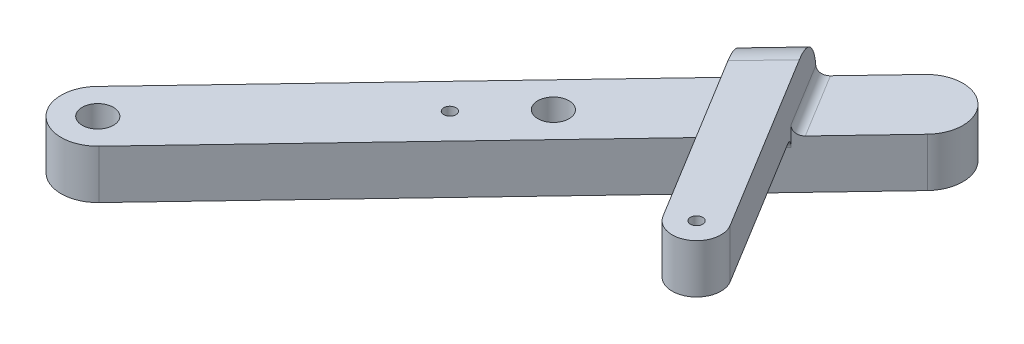
ISO-10303-21;
HEADER;
FILE_DESCRIPTION(('STEP AP214'),'2;1');
FILE_NAME('part.step','',(''),(''),'','','');
FILE_SCHEMA(('AUTOMOTIVE_DESIGN { 1 0 10303 214 1 1 1 1 }'));
ENDSEC;
DATA;
#1=APPLICATION_CONTEXT('core data for automotive mechanical design processes');
#2=APPLICATION_PROTOCOL_DEFINITION('international standard','automotive_design',2000,#1);
#3=PRODUCT_CONTEXT('',#1,'mechanical');
#4=PRODUCT('Part','Part','',(#3));
#5=PRODUCT_RELATED_PRODUCT_CATEGORY('part','',(#4));
#6=PRODUCT_DEFINITION_FORMATION('','',#4);
#7=PRODUCT_DEFINITION_CONTEXT('part definition',#1,'design');
#8=PRODUCT_DEFINITION('design','',#6,#7);
#9=PRODUCT_DEFINITION_SHAPE('','',#8);
#10=(LENGTH_UNIT() NAMED_UNIT(*) SI_UNIT(.MILLI.,.METRE.));
#11=(NAMED_UNIT(*) PLANE_ANGLE_UNIT() SI_UNIT($,.RADIAN.));
#12=(NAMED_UNIT(*) SI_UNIT($,.STERADIAN.) SOLID_ANGLE_UNIT());
#13=UNCERTAINTY_MEASURE_WITH_UNIT(LENGTH_MEASURE(1.E-05),#10,'distance_accuracy_value','');
#14=(GEOMETRIC_REPRESENTATION_CONTEXT(3) GLOBAL_UNCERTAINTY_ASSIGNED_CONTEXT((#13)) GLOBAL_UNIT_ASSIGNED_CONTEXT((#10,
#11,#12)) REPRESENTATION_CONTEXT('',''));
#15=CARTESIAN_POINT('',(0.,0.,0.));
#16=DIRECTION('',(0.,0.,1.));
#17=DIRECTION('',(1.,0.,0.));
#18=AXIS2_PLACEMENT_3D('',#15,#16,#17);
#19=CARTESIAN_POINT('',(0.,0.,0.));
#20=DIRECTION('',(0.,1.,0.));
#21=DIRECTION('',(0.,0.,1.));
#22=AXIS2_PLACEMENT_3D('',#19,#20,#21);
#23=PLANE('',#22);
#24=DIRECTION('',(0.689150046593771,0.,-0.724618667493326));
#25=VECTOR('',#24,1.);
#26=CARTESIAN_POINT('',(-4.93378544040316,0.,-4.69228660351733));
#27=LINE('',#26,#25);
#28=CARTESIAN_POINT('',(64.1179855432319,0.,-77.2979586563996));
#29=VERTEX_POINT('',#28);
#30=CARTESIAN_POINT('',(73.5491158361503,0.,-87.2144827857797));
#31=VERTEX_POINT('',#30);
#32=EDGE_CURVE('E214',#29,#31,#27,.T.);
#33=ORIENTED_EDGE('',*,*,#32,.F.);
#34=DIRECTION('',(0.521562728151214,0.,0.853212939777324));
#35=VECTOR('',#34,1.);
#36=CARTESIAN_POINT('',(72.4969122025222,0.,-63.5910577194925));
#37=LINE('',#36,#35);
#38=CARTESIAN_POINT('',(72.2174075789016,0.,-64.0482931558628));
#39=VERTEX_POINT('',#38);
#40=EDGE_CURVE('E243',#29,#39,#37,.T.);
#41=ORIENTED_EDGE('',*,*,#40,.T.);
#42=DIRECTION('',(0.689150046593771,0.,-0.724618667493326));
#43=VECTOR('',#42,1.);
#44=CARTESIAN_POINT('',(5.93549457199673,0.,5.64496409538924));
#45=LINE('',#44,#43);
#46=CARTESIAN_POINT('',(84.4183958485502,0.,-76.8772320868731));
#47=VERTEX_POINT('',#46);
#48=EDGE_CURVE('E207',#39,#47,#45,.T.);
#49=ORIENTED_EDGE('',*,*,#48,.T.);
#50=CARTESIAN_POINT('',(78.9837558423502,0.,-82.0458574363263));
#51=DIRECTION('',(0.,1.,0.));
#52=DIRECTION('',(0.,0.,1.));
#53=AXIS2_PLACEMENT_3D('',#50,#51,#52);
#54=CIRCLE('',#53,7.49999999999997);
#55=EDGE_CURVE('E208',#31,#47,#54,.F.);
#56=ORIENTED_EDGE('',*,*,#55,.F.);
#57=EDGE_LOOP('',(#33,#41,#49,#56));
#58=FACE_BOUND('',#57,.T.);
#59=ADVANCED_FACE('F41',(#58),#23,.T.);
#60=CARTESIAN_POINT('',(-3.7142497489023,-10.,4.90838266287273));
#61=DIRECTION('',(0.,1.,0.));
#62=DIRECTION('',(0.,0.,1.));
#63=AXIS2_PLACEMENT_3D('',#60,#61,#62);
#64=CYLINDRICAL_SURFACE('',#63,7.5);
#65=CARTESIAN_POINT('',(-3.7142497489023,0.,4.90838266287273));
#66=DIRECTION('',(0.,1.,0.));
#67=DIRECTION('',(0.,0.,1.));
#68=AXIS2_PLACEMENT_3D('',#65,#66,#67);
#69=CIRCLE('',#68,7.5);
#70=CARTESIAN_POINT('',(1.72039025729765,0.,10.077008012326));
#71=VERTEX_POINT('',#70);
#72=CARTESIAN_POINT('',(-9.14888975510225,0.,-0.260242686580554));
#73=VERTEX_POINT('',#72);
#74=EDGE_CURVE('E202',#71,#73,#69,.F.);
#75=ORIENTED_EDGE('',*,*,#74,.T.);
#76=DIRECTION('',(0.,1.,0.));
#77=VECTOR('',#76,1.);
#78=CARTESIAN_POINT('',(-9.14888975510225,-10.,-0.260242686580554));
#79=LINE('',#78,#77);
#80=CARTESIAN_POINT('',(-9.14888975510225,-10.,-0.260242686580554));
#81=VERTEX_POINT('',#80);
#82=EDGE_CURVE('E217',#81,#73,#79,.T.);
#83=ORIENTED_EDGE('',*,*,#82,.F.);
#84=CARTESIAN_POINT('',(-3.7142497489023,-10.,4.90838266287273));
#85=DIRECTION('',(0.,1.,0.));
#86=DIRECTION('',(0.,0.,1.));
#87=AXIS2_PLACEMENT_3D('',#84,#85,#86);
#88=CIRCLE('',#87,7.5);
#89=CARTESIAN_POINT('',(1.72039025729765,-10.,10.077008012326));
#90=VERTEX_POINT('',#89);
#91=EDGE_CURVE('E183',#90,#81,#88,.F.);
#92=ORIENTED_EDGE('',*,*,#91,.F.);
#93=DIRECTION('',(0.,1.,0.));
#94=VECTOR('',#93,1.);
#95=CARTESIAN_POINT('',(1.72039025729765,-10.,10.077008012326));
#96=LINE('',#95,#94);
#97=EDGE_CURVE('E200',#90,#71,#96,.T.);
#98=ORIENTED_EDGE('',*,*,#97,.T.);
#99=EDGE_LOOP('',(#75,#83,#92,#98));
#100=FACE_BOUND('',#99,.T.);
#101=ADVANCED_FACE('F291',(#100),#64,.T.);
#102=CARTESIAN_POINT('',(-4.93378544040316,-10.,-4.69228660351733));
#103=DIRECTION('',(0.724618667493326,0.,0.689150046593771));
#104=DIRECTION('',(0.689150046593771,0.,-0.724618667493326));
#105=AXIS2_PLACEMENT_3D('',#102,#103,#104);
#106=PLANE('',#105);
#107=CARTESIAN_POINT('',(54.1295367516934,0.,-66.795432407691));
#108=VERTEX_POINT('',#107);
#109=EDGE_CURVE('E213',#73,#108,#27,.T.);
#110=ORIENTED_EDGE('',*,*,#109,.T.);
#111=DIRECTION('',(0.689150046593771,0.,-0.724618667493326));
#112=VECTOR('',#111,1.);
#113=CARTESIAN_POINT('',(62.6910642872978,0.,-75.797597763727));
#114=LINE('',#113,#112);
#115=EDGE_CURVE('E225',#108,#29,#114,.T.);
#116=ORIENTED_EDGE('',*,*,#115,.T.);
#117=ORIENTED_EDGE('',*,*,#32,.T.);
#118=DIRECTION('',(0.,1.,0.));
#119=VECTOR('',#118,1.);
#120=CARTESIAN_POINT('',(73.5491158361503,-10.,-87.2144827857797));
#121=LINE('',#120,#119);
#122=CARTESIAN_POINT('',(73.5491158361503,-10.,-87.2144827857797));
#123=VERTEX_POINT('',#122);
#124=EDGE_CURVE('E222',#123,#31,#121,.T.);
#125=ORIENTED_EDGE('',*,*,#124,.F.);
#126=DIRECTION('',(0.689150046593771,0.,-0.724618667493326));
#127=VECTOR('',#126,1.);
#128=CARTESIAN_POINT('',(-4.93378544040316,-10.,-4.69228660351733));
#129=LINE('',#128,#127);
#130=EDGE_CURVE('E192',#81,#123,#129,.T.);
#131=ORIENTED_EDGE('',*,*,#130,.F.);
#132=ORIENTED_EDGE('',*,*,#82,.T.);
#133=EDGE_LOOP('',(#110,#116,#117,#125,#131,#132));
#134=FACE_BOUND('',#133,.T.);
#135=ADVANCED_FACE('F305',(#134),#106,.F.);
#136=CARTESIAN_POINT('',(78.9837558423502,-10.,-82.0458574363263));
#137=DIRECTION('',(0.,1.,0.));
#138=DIRECTION('',(0.,0.,1.));
#139=AXIS2_PLACEMENT_3D('',#136,#137,#138);
#140=CYLINDRICAL_SURFACE('',#139,7.49999999999997);
#141=ORIENTED_EDGE('',*,*,#55,.T.);
#142=DIRECTION('',(0.,1.,0.));
#143=VECTOR('',#142,1.);
#144=CARTESIAN_POINT('',(84.4183958485502,-10.,-76.8772320868731));
#145=LINE('',#144,#143);
#146=CARTESIAN_POINT('',(84.4183958485502,-10.,-76.8772320868731));
#147=VERTEX_POINT('',#146);
#148=EDGE_CURVE('E228',#147,#47,#145,.T.);
#149=ORIENTED_EDGE('',*,*,#148,.F.);
#150=CARTESIAN_POINT('',(78.9837558423502,-10.,-82.0458574363263));
#151=DIRECTION('',(0.,1.,0.));
#152=DIRECTION('',(0.,0.,1.));
#153=AXIS2_PLACEMENT_3D('',#150,#151,#152);
#154=CIRCLE('',#153,7.49999999999997);
#155=EDGE_CURVE('E188',#123,#147,#154,.F.);
#156=ORIENTED_EDGE('',*,*,#155,.F.);
#157=ORIENTED_EDGE('',*,*,#124,.T.);
#158=EDGE_LOOP('',(#141,#149,#156,#157));
#159=FACE_BOUND('',#158,.T.);
#160=ADVANCED_FACE('F338',(#159),#140,.T.);
#161=CARTESIAN_POINT('',(5.93549457199673,-10.,5.64496409538924));
#162=DIRECTION('',(0.724618667493326,0.,0.689150046593771));
#163=DIRECTION('',(0.689150046593771,0.,-0.724618667493326));
#164=AXIS2_PLACEMENT_3D('',#161,#162,#163);
#165=PLANE('',#164);
#166=DIRECTION('',(0.,1.,0.));
#167=VECTOR('',#166,1.);
#168=CARTESIAN_POINT('',(70.7904863229676,-10.,-62.5479322631901));
#169=LINE('',#168,#167);
#170=CARTESIAN_POINT('',(70.7904863229676,-2.,-62.5479322631901));
#171=VERTEX_POINT('',#170);
#172=CARTESIAN_POINT('',(70.7904863229676,2.,-62.5479322631901));
#173=VERTEX_POINT('',#172);
#174=EDGE_CURVE('E57',#171,#173,#169,.T.);
#175=ORIENTED_EDGE('',*,*,#174,.F.);
#176=DIRECTION('',(0.689150046593771,0.,-0.724618667493326));
#177=VECTOR('',#176,1.);
#178=CARTESIAN_POINT('',(5.93549457199673,-2.,5.64496409538924));
#179=LINE('',#178,#177);
#180=CARTESIAN_POINT('',(63.6558800432973,-2.,-55.0461277998267));
#181=VERTEX_POINT('',#180);
#182=EDGE_CURVE('E373',#171,#181,#179,.F.);
#183=ORIENTED_EDGE('',*,*,#182,.T.);
#184=DIRECTION('',(0.,-1.,0.));
#185=VECTOR('',#184,1.);
#186=CARTESIAN_POINT('',(63.6558800432973,10.,-55.0461277998267));
#187=LINE('',#186,#185);
#188=CARTESIAN_POINT('',(63.6558800432973,2.,-55.0461277998267));
#189=VERTEX_POINT('',#188);
#190=EDGE_CURVE('E64',#189,#181,#187,.T.);
#191=ORIENTED_EDGE('',*,*,#190,.F.);
#192=CARTESIAN_POINT('',(62.2289587873632,2.,-53.5457669071541));
#193=DIRECTION('',(0.724618667493326,0.,0.689150046593771));
#194=DIRECTION('',(-0.689150046593771,0.,0.724618667493326));
#195=AXIS2_PLACEMENT_3D('',#192,#193,#194);
#196=ELLIPSE('',#195,2.07055236082017,2.);
#197=CARTESIAN_POINT('',(62.2289587873632,0.,-53.5457669071541));
#198=VERTEX_POINT('',#197);
#199=EDGE_CURVE('E248',#189,#198,#196,.F.);
#200=ORIENTED_EDGE('',*,*,#199,.T.);
#201=EDGE_CURVE('E210',#71,#198,#45,.T.);
#202=ORIENTED_EDGE('',*,*,#201,.F.);
#203=ORIENTED_EDGE('',*,*,#97,.F.);
#204=DIRECTION('',(0.689150046593771,0.,-0.724618667493326));
#205=VECTOR('',#204,1.);
#206=CARTESIAN_POINT('',(5.93549457199673,-10.,5.64496409538924));
#207=LINE('',#206,#205);
#208=EDGE_CURVE('E190',#90,#147,#207,.T.);
#209=ORIENTED_EDGE('',*,*,#208,.T.);
#210=ORIENTED_EDGE('',*,*,#148,.T.);
#211=ORIENTED_EDGE('',*,*,#48,.F.);
#212=CARTESIAN_POINT('',(72.2174075789016,2.,-64.0482931558628));
#213=DIRECTION('',(0.724618667493326,0.,0.689150046593771));
#214=DIRECTION('',(0.689150046593771,0.,-0.724618667493326));
#215=AXIS2_PLACEMENT_3D('',#212,#213,#214);
#216=ELLIPSE('',#215,2.07055236082017,2.);
#217=EDGE_CURVE('E258',#39,#173,#216,.F.);
#218=ORIENTED_EDGE('',*,*,#217,.T.);
#219=EDGE_LOOP('',(#175,#183,#191,#200,#202,#203,#209,#210,#211,#218));
#220=FACE_BOUND('',#219,.T.);
#221=ADVANCED_FACE('F343',(#220),#165,.T.);
#222=CARTESIAN_POINT('',(41.7696533262866,-10.,-42.9164493916868));
#223=DIRECTION('',(0.,1.,0.));
#224=DIRECTION('',(0.,0.,1.));
#225=AXIS2_PLACEMENT_3D('',#222,#223,#224);
#226=CYLINDRICAL_SURFACE('',#225,3.2);
#227=CARTESIAN_POINT('',(41.7696533262866,-10.,-42.9164493916868));
#228=DIRECTION('',(0.,1.,0.));
#229=DIRECTION('',(0.,0.,1.));
#230=AXIS2_PLACEMENT_3D('',#227,#228,#229);
#231=CIRCLE('',#230,3.2);
#232=CARTESIAN_POINT('',(41.7696533262866,-10.,-39.7164493916868));
#233=VERTEX_POINT('',#232);
#234=EDGE_CURVE('E179',#233,#233,#231,.T.);
#235=ORIENTED_EDGE('',*,*,#234,.F.);
#236=EDGE_LOOP('',(#235));
#237=FACE_BOUND('',#236,.T.);
#238=CARTESIAN_POINT('',(41.7696533262866,0.,-42.9164493916868));
#239=DIRECTION('',(0.,1.,0.));
#240=DIRECTION('',(0.,0.,1.));
#241=AXIS2_PLACEMENT_3D('',#238,#239,#240);
#242=CIRCLE('',#241,3.2);
#243=CARTESIAN_POINT('',(41.7696533262866,0.,-39.7164493916868));
#244=VERTEX_POINT('',#243);
#245=EDGE_CURVE('E199',#244,#244,#242,.T.);
#246=ORIENTED_EDGE('',*,*,#245,.T.);
#247=EDGE_LOOP('',(#246));
#248=FACE_BOUND('',#247,.T.);
#249=ADVANCED_FACE('F334',(#237,#248),#226,.F.);
#250=CARTESIAN_POINT('',(31.43240262738,-10.,-32.0471693792869));
#251=DIRECTION('',(0.,1.,0.));
#252=DIRECTION('',(0.,0.,1.));
#253=AXIS2_PLACEMENT_3D('',#250,#251,#252);
#254=CYLINDRICAL_SURFACE('',#253,1.25);
#255=CARTESIAN_POINT('',(31.43240262738,-10.,-32.0471693792869));
#256=DIRECTION('',(0.,1.,0.));
#257=DIRECTION('',(0.,0.,1.));
#258=AXIS2_PLACEMENT_3D('',#255,#256,#257);
#259=CIRCLE('',#258,1.25);
#260=CARTESIAN_POINT('',(31.43240262738,-10.,-30.7971693792869));
#261=VERTEX_POINT('',#260);
#262=EDGE_CURVE('E180',#261,#261,#259,.T.);
#263=ORIENTED_EDGE('',*,*,#262,.F.);
#264=EDGE_LOOP('',(#263));
#265=FACE_BOUND('',#264,.T.);
#266=CARTESIAN_POINT('',(31.43240262738,0.,-32.0471693792869));
#267=DIRECTION('',(0.,1.,0.));
#268=DIRECTION('',(0.,0.,1.));
#269=AXIS2_PLACEMENT_3D('',#266,#267,#268);
#270=CIRCLE('',#269,1.25);
#271=CARTESIAN_POINT('',(31.43240262738,0.,-30.7971693792869));
#272=VERTEX_POINT('',#271);
#273=EDGE_CURVE('E156',#272,#272,#270,.T.);
#274=ORIENTED_EDGE('',*,*,#273,.T.);
#275=EDGE_LOOP('',(#274));
#276=FACE_BOUND('',#275,.T.);
#277=ADVANCED_FACE('F267',(#265,#276),#254,.F.);
#278=CARTESIAN_POINT('',(-3.7142497489023,-10.,4.90838266287273));
#279=DIRECTION('',(0.,1.,0.));
#280=DIRECTION('',(0.,0.,1.));
#281=AXIS2_PLACEMENT_3D('',#278,#279,#280);
#282=CYLINDRICAL_SURFACE('',#281,3.2);
#283=CARTESIAN_POINT('',(-3.7142497489023,-10.,4.90838266287273));
#284=DIRECTION('',(0.,1.,0.));
#285=DIRECTION('',(0.,0.,1.));
#286=AXIS2_PLACEMENT_3D('',#283,#284,#285);
#287=CIRCLE('',#286,3.2);
#288=CARTESIAN_POINT('',(-3.7142497489023,-10.,8.10838266287273));
#289=VERTEX_POINT('',#288);
#290=EDGE_CURVE('E193',#289,#289,#287,.T.);
#291=ORIENTED_EDGE('',*,*,#290,.F.);
#292=EDGE_LOOP('',(#291));
#293=FACE_BOUND('',#292,.T.);
#294=CARTESIAN_POINT('',(-3.7142497489023,0.,4.90838266287273));
#295=DIRECTION('',(0.,1.,0.));
#296=DIRECTION('',(0.,0.,1.));
#297=AXIS2_PLACEMENT_3D('',#294,#295,#296);
#298=CIRCLE('',#297,3.2);
#299=CARTESIAN_POINT('',(-3.7142497489023,0.,8.10838266287273));
#300=VERTEX_POINT('',#299);
#301=EDGE_CURVE('E181',#300,#300,#298,.T.);
#302=ORIENTED_EDGE('',*,*,#301,.T.);
#303=EDGE_LOOP('',(#302));
#304=FACE_BOUND('',#303,.T.);
#305=ADVANCED_FACE('F319',(#293,#304),#282,.F.);
#306=CARTESIAN_POINT('',(0.,-10.,0.));
#307=DIRECTION('',(0.,1.,0.));
#308=DIRECTION('',(0.,0.,1.));
#309=AXIS2_PLACEMENT_3D('',#306,#307,#308);
#310=PLANE('',#309);
#311=ORIENTED_EDGE('',*,*,#262,.T.);
#312=EDGE_LOOP('',(#311));
#313=FACE_BOUND('',#312,.T.);
#314=ORIENTED_EDGE('',*,*,#234,.T.);
#315=EDGE_LOOP('',(#314));
#316=FACE_BOUND('',#315,.T.);
#317=ORIENTED_EDGE('',*,*,#91,.T.);
#318=ORIENTED_EDGE('',*,*,#130,.T.);
#319=ORIENTED_EDGE('',*,*,#155,.T.);
#320=ORIENTED_EDGE('',*,*,#208,.F.);
#321=EDGE_LOOP('',(#317,#318,#319,#320));
#322=FACE_BOUND('',#321,.T.);
#323=ORIENTED_EDGE('',*,*,#290,.T.);
#324=EDGE_LOOP('',(#323));
#325=FACE_BOUND('',#324,.T.);
#326=ADVANCED_FACE('F309',(#313,#316,#322,#325),#310,.F.);
#327=ORIENTED_EDGE('',*,*,#201,.T.);
#328=DIRECTION('',(0.521562728151213,0.,0.853212939777324));
#329=VECTOR('',#328,1.);
#330=CARTESIAN_POINT('',(69.1290436652468,0.,-42.2580705561502));
#331=LINE('',#330,#329);
#332=EDGE_CURVE('E239',#198,#108,#331,.F.);
#333=ORIENTED_EDGE('',*,*,#332,.T.);
#334=ORIENTED_EDGE('',*,*,#109,.F.);
#335=ORIENTED_EDGE('',*,*,#74,.F.);
#336=EDGE_LOOP('',(#327,#333,#334,#335));
#337=FACE_BOUND('',#336,.T.);
#338=ORIENTED_EDGE('',*,*,#273,.F.);
#339=EDGE_LOOP('',(#338));
#340=FACE_BOUND('',#339,.T.);
#341=ORIENTED_EDGE('',*,*,#245,.F.);
#342=EDGE_LOOP('',(#341));
#343=FACE_BOUND('',#342,.T.);
#344=ORIENTED_EDGE('',*,*,#301,.F.);
#345=EDGE_LOOP('',(#344));
#346=FACE_BOUND('',#345,.T.);
#347=ADVANCED_FACE('F298',(#337,#340,#343,#346),#23,.T.);
#348=CARTESIAN_POINT('',(0.,0.,0.));
#349=DIRECTION('',(0.,1.,0.));
#350=DIRECTION('',(0.,0.,1.));
#351=AXIS2_PLACEMENT_3D('',#348,#349,#350);
#352=PLANE('',#351);
#353=CARTESIAN_POINT('',(86.1218345996952,0.,-27.8811438635889));
#354=DIRECTION('',(0.,1.,0.));
#355=DIRECTION('',(0.,0.,1.));
#356=AXIS2_PLACEMENT_3D('',#353,#354,#355);
#357=CIRCLE('',#356,1.25000000000001);
#358=CARTESIAN_POINT('',(86.1218345996952,0.,-26.6311438635889));
#359=VERTEX_POINT('',#358);
#360=EDGE_CURVE('E169',#359,#359,#357,.T.);
#361=ORIENTED_EDGE('',*,*,#360,.T.);
#362=EDGE_LOOP('',(#361));
#363=FACE_BOUND('',#362,.T.);
#364=DIRECTION('',(0.521562728151213,0.,0.853212939777324));
#365=VECTOR('',#364,1.);
#366=CARTESIAN_POINT('',(70.8354695448014,0.,-43.3011960124526));
#367=LINE('',#366,#365);
#368=CARTESIAN_POINT('',(64.7358029813866,0.,-53.2795057330885));
#369=VERTEX_POINT('',#368);
#370=CARTESIAN_POINT('',(81.8557699008086,0.,-25.2733302228328));
#371=VERTEX_POINT('',#370);
#372=EDGE_CURVE('E164',#369,#371,#367,.T.);
#373=ORIENTED_EDGE('',*,*,#372,.F.);
#374=DIRECTION('',(0.689150046593771,0.,-0.724618667493326));
#375=VECTOR('',#374,1.);
#376=CARTESIAN_POINT('',(7.38473190698338,0.,7.02326418857678));
#377=LINE('',#376,#375);
#378=CARTESIAN_POINT('',(71.8704092610569,0.,-60.7813101964518));
#379=VERTEX_POINT('',#378);
#380=EDGE_CURVE('E279',#369,#379,#377,.T.);
#381=ORIENTED_EDGE('',*,*,#380,.T.);
#382=DIRECTION('',(0.521562728151214,0.,0.853212939777324));
#383=VECTOR('',#382,1.);
#384=CARTESIAN_POINT('',(79.3675989425746,0.,-48.5168232939648));
#385=LINE('',#384,#383);
#386=CARTESIAN_POINT('',(90.3878992985819,0.,-30.488957504345));
#387=VERTEX_POINT('',#386);
#388=EDGE_CURVE('E173',#379,#387,#385,.T.);
#389=ORIENTED_EDGE('',*,*,#388,.T.);
#390=CARTESIAN_POINT('',(86.1218345996952,0.,-27.8811438635889));
#391=DIRECTION('',(0.,1.,0.));
#392=DIRECTION('',(0.,0.,1.));
#393=AXIS2_PLACEMENT_3D('',#390,#391,#392);
#394=CIRCLE('',#393,5.);
#395=EDGE_CURVE('E154',#387,#371,#394,.F.);
#396=ORIENTED_EDGE('',*,*,#395,.T.);
#397=EDGE_LOOP('',(#373,#381,#389,#396));
#398=FACE_BOUND('',#397,.T.);
#399=ADVANCED_FACE('F307',(#363,#398),#352,.F.);
#400=CARTESIAN_POINT('',(86.1218345996952,10.,-27.8811438635889));
#401=DIRECTION('',(0.,-1.,0.));
#402=DIRECTION('',(0.,0.,-1.));
#403=AXIS2_PLACEMENT_3D('',#400,#401,#402);
#404=CYLINDRICAL_SURFACE('',#403,5.);
#405=ORIENTED_EDGE('',*,*,#395,.F.);
#406=DIRECTION('',(0.,-1.,0.));
#407=VECTOR('',#406,1.);
#408=CARTESIAN_POINT('',(90.3878992985819,10.,-30.488957504345));
#409=LINE('',#408,#407);
#410=CARTESIAN_POINT('',(90.3878992985819,10.,-30.488957504345));
#411=VERTEX_POINT('',#410);
#412=EDGE_CURVE('E139',#411,#387,#409,.T.);
#413=ORIENTED_EDGE('',*,*,#412,.F.);
#414=CARTESIAN_POINT('',(86.1218345996952,10.,-27.8811438635889));
#415=DIRECTION('',(0.,1.,0.));
#416=DIRECTION('',(0.,0.,1.));
#417=AXIS2_PLACEMENT_3D('',#414,#415,#416);
#418=CIRCLE('',#417,5.);
#419=CARTESIAN_POINT('',(81.8557699008086,10.,-25.2733302228328));
#420=VERTEX_POINT('',#419);
#421=EDGE_CURVE('E149',#411,#420,#418,.F.);
#422=ORIENTED_EDGE('',*,*,#421,.T.);
#423=DIRECTION('',(0.,-1.,0.));
#424=VECTOR('',#423,1.);
#425=CARTESIAN_POINT('',(81.8557699008086,10.,-25.2733302228328));
#426=LINE('',#425,#424);
#427=EDGE_CURVE('E160',#420,#371,#426,.T.);
#428=ORIENTED_EDGE('',*,*,#427,.T.);
#429=EDGE_LOOP('',(#405,#413,#422,#428));
#430=FACE_BOUND('',#429,.T.);
#431=ADVANCED_FACE('F155',(#430),#404,.T.);
#432=CARTESIAN_POINT('',(79.3675989425746,10.,-48.5168232939648));
#433=DIRECTION('',(0.853212939777324,0.,-0.521562728151214));
#434=DIRECTION('',(-0.521562728151214,0.,-0.853212939777324));
#435=AXIS2_PLACEMENT_3D('',#432,#433,#434);
#436=PLANE('',#435);
#437=ORIENTED_EDGE('',*,*,#388,.F.);
#438=CARTESIAN_POINT('',(71.8704092610569,-2.,-60.7813101964518));
#439=DIRECTION('',(0.853212939777324,0.,-0.521562728151214));
#440=DIRECTION('',(-0.521562728151214,0.,-0.853212939777324));
#441=AXIS2_PLACEMENT_3D('',#438,#439,#440);
#442=ELLIPSE('',#441,2.07055236082017,2.);
#443=EDGE_CURVE('E47',#379,#171,#442,.F.);
#444=ORIENTED_EDGE('',*,*,#443,.T.);
#445=ORIENTED_EDGE('',*,*,#174,.T.);
#446=DIRECTION('',(0.521562728151214,0.,0.853212939777324));
#447=VECTOR('',#446,1.);
#448=CARTESIAN_POINT('',(62.6910642872978,2.,-75.797597763727));
#449=LINE('',#448,#447);
#450=CARTESIAN_POINT('',(62.8001586580523,2.,-75.6191326937352));
#451=VERTEX_POINT('',#450);
#452=EDGE_CURVE('E246',#173,#451,#449,.F.);
#453=ORIENTED_EDGE('',*,*,#452,.T.);
#454=CARTESIAN_POINT('',(68.0906789777443,0.,-66.9644874300357));
#455=DIRECTION('',(0.853212939777324,0.,-0.521562728151214));
#456=DIRECTION('',(0.521562728151214,0.,0.853212939777324));
#457=AXIS2_PLACEMENT_3D('',#454,#455,#456);
#458=ELLIPSE('',#457,10.3527618041008,10.);
#459=CARTESIAN_POINT('',(68.0906789777443,10.,-66.9644874300357));
#460=VERTEX_POINT('',#459);
#461=EDGE_CURVE('E141',#451,#460,#458,.T.);
#462=ORIENTED_EDGE('',*,*,#461,.T.);
#463=DIRECTION('',(0.521562728151214,0.,0.853212939777324));
#464=VECTOR('',#463,1.);
#465=CARTESIAN_POINT('',(79.3675989425746,10.,-48.5168232939648));
#466=LINE('',#465,#464);
#467=EDGE_CURVE('E136',#460,#411,#466,.T.);
#468=ORIENTED_EDGE('',*,*,#467,.T.);
#469=ORIENTED_EDGE('',*,*,#412,.T.);
#470=EDGE_LOOP('',(#437,#444,#445,#453,#462,#468,#469));
#471=FACE_BOUND('',#470,.T.);
#472=ADVANCED_FACE('F138',(#471),#436,.T.);
#473=CARTESIAN_POINT('',(86.1218345996952,10.,-27.8811438635889));
#474=DIRECTION('',(0.,-1.,0.));
#475=DIRECTION('',(0.,0.,-1.));
#476=AXIS2_PLACEMENT_3D('',#473,#474,#475);
#477=CYLINDRICAL_SURFACE('',#476,1.25000000000001);
#478=CARTESIAN_POINT('',(86.1218345996952,10.,-27.8811438635889));
#479=DIRECTION('',(0.,1.,0.));
#480=DIRECTION('',(0.,0.,1.));
#481=AXIS2_PLACEMENT_3D('',#478,#479,#480);
#482=CIRCLE('',#481,1.25000000000001);
#483=CARTESIAN_POINT('',(86.1218345996952,10.,-26.6311438635889));
#484=VERTEX_POINT('',#483);
#485=EDGE_CURVE('E162',#484,#484,#482,.T.);
#486=ORIENTED_EDGE('',*,*,#485,.T.);
#487=EDGE_LOOP('',(#486));
#488=FACE_BOUND('',#487,.T.);
#489=ORIENTED_EDGE('',*,*,#360,.F.);
#490=EDGE_LOOP('',(#489));
#491=FACE_BOUND('',#490,.T.);
#492=ADVANCED_FACE('F380',(#488,#491),#477,.F.);
#493=CARTESIAN_POINT('',(70.8354695448014,10.,-43.3011960124526));
#494=DIRECTION('',(0.853212939777324,0.,-0.521562728151213));
#495=DIRECTION('',(-0.521562728151213,0.,-0.853212939777324));
#496=AXIS2_PLACEMENT_3D('',#493,#494,#495);
#497=PLANE('',#496);
#498=CARTESIAN_POINT('',(60.956072698074,0.,-59.4626829666723));
#499=DIRECTION('',(0.853212939777324,0.,-0.521562728151213));
#500=DIRECTION('',(0.521562728151213,0.,0.853212939777324));
#501=AXIS2_PLACEMENT_3D('',#498,#499,#500);
#502=ELLIPSE('',#501,10.3527618041008,10.);
#503=CARTESIAN_POINT('',(60.956072698074,10.,-59.4626829666724));
#504=VERTEX_POINT('',#503);
#505=CARTESIAN_POINT('',(55.665552378382,2.,-68.1173282303719));
#506=VERTEX_POINT('',#505);
#507=EDGE_CURVE('E234',#504,#506,#502,.F.);
#508=ORIENTED_EDGE('',*,*,#507,.T.);
#509=DIRECTION('',(0.521562728151213,0.,0.853212939777324));
#510=VECTOR('',#509,1.);
#511=CARTESIAN_POINT('',(70.8354695448014,2.,-43.3011960124526));
#512=LINE('',#511,#510);
#513=EDGE_CURVE('E238',#506,#189,#512,.T.);
#514=ORIENTED_EDGE('',*,*,#513,.T.);
#515=ORIENTED_EDGE('',*,*,#190,.T.);
#516=CARTESIAN_POINT('',(64.7358029813866,-2.,-53.2795057330885));
#517=DIRECTION('',(0.853212939777324,0.,-0.521562728151213));
#518=DIRECTION('',(-0.521562728151213,0.,-0.853212939777324));
#519=AXIS2_PLACEMENT_3D('',#516,#517,#518);
#520=ELLIPSE('',#519,2.07055236082017,2.);
#521=EDGE_CURVE('E11',#181,#369,#520,.T.);
#522=ORIENTED_EDGE('',*,*,#521,.T.);
#523=ORIENTED_EDGE('',*,*,#372,.T.);
#524=ORIENTED_EDGE('',*,*,#427,.F.);
#525=DIRECTION('',(0.521562728151213,0.,0.853212939777324));
#526=VECTOR('',#525,1.);
#527=CARTESIAN_POINT('',(70.8354695448014,10.,-43.3011960124526));
#528=LINE('',#527,#526);
#529=EDGE_CURVE('E147',#504,#420,#528,.T.);
#530=ORIENTED_EDGE('',*,*,#529,.F.);
#531=EDGE_LOOP('',(#508,#514,#515,#522,#523,#524,#530));
#532=FACE_BOUND('',#531,.T.);
#533=ADVANCED_FACE('F366',(#532),#497,.F.);
#534=CARTESIAN_POINT('',(0.,10.,0.));
#535=DIRECTION('',(0.,1.,0.));
#536=DIRECTION('',(0.,0.,1.));
#537=AXIS2_PLACEMENT_3D('',#534,#535,#536);
#538=PLANE('',#537);
#539=ORIENTED_EDGE('',*,*,#485,.F.);
#540=EDGE_LOOP('',(#539));
#541=FACE_BOUND('',#540,.T.);
#542=ORIENTED_EDGE('',*,*,#467,.F.);
#543=DIRECTION('',(0.689150046593771,0.,-0.724618667493326));
#544=VECTOR('',#543,1.);
#545=CARTESIAN_POINT('',(62.8026446825607,10.,-61.4042928344259));
#546=LINE('',#545,#544);
#547=EDGE_CURVE('E235',#460,#504,#546,.F.);
#548=ORIENTED_EDGE('',*,*,#547,.T.);
#549=ORIENTED_EDGE('',*,*,#529,.T.);
#550=ORIENTED_EDGE('',*,*,#421,.F.);
#551=EDGE_LOOP('',(#542,#548,#549,#550));
#552=FACE_BOUND('',#551,.T.);
#553=ADVANCED_FACE('F158',(#541,#552),#538,.T.);
#554=CARTESIAN_POINT('',(2.31240123453009,0.,2.19921386242038));
#555=DIRECTION('',(-0.689150046593771,0.,0.724618667493326));
#556=DIRECTION('',(0.724618667493326,0.,0.689150046593771));
#557=AXIS2_PLACEMENT_3D('',#554,#555,#556);
#558=CYLINDRICAL_SURFACE('',#557,10.);
#559=ORIENTED_EDGE('',*,*,#507,.F.);
#560=ORIENTED_EDGE('',*,*,#547,.F.);
#561=ORIENTED_EDGE('',*,*,#461,.F.);
#562=CARTESIAN_POINT('',(62.8001586580523,2.,-75.6191326937352));
#563=CARTESIAN_POINT('',(62.7937999502857,1.94231729086801,-75.6295362808688));
#564=CARTESIAN_POINT('',(62.7895172126409,1.88468567561924,-75.6413284206635));
#565=CARTESIAN_POINT('',(62.7850951465395,1.76989118915976,-75.6676367172041));
#566=CARTESIAN_POINT('',(62.7849555374058,1.71272828645829,-75.6821526893561));
#567=CARTESIAN_POINT('',(62.7907309198984,1.54268141925045,-75.7296530543318));
#568=CARTESIAN_POINT('',(62.8028177160845,1.43103268569633,-75.7666270844644));
#569=CARTESIAN_POINT('',(62.8427893004628,1.214547153245,-75.8505837994839));
#570=CARTESIAN_POINT('',(62.8706806677639,1.10971321147346,-75.8975706474097));
#571=CARTESIAN_POINT('',(62.9409410520679,0.909969233319101,-76.0008672588863));
#572=CARTESIAN_POINT('',(62.9833073482399,0.815057336279752,-76.0571752693272));
#573=CARTESIAN_POINT('',(63.0807838143214,0.637767437620477,-76.1784113273961));
#574=CARTESIAN_POINT('',(63.1359242330715,0.55541996831433,-76.2433596772381));
#575=CARTESIAN_POINT('',(63.2566222965773,0.405934604818675,-76.3807108956735));
#576=CARTESIAN_POINT('',(63.3221827964974,0.338800891555148,-76.4531158054891));
#577=CARTESIAN_POINT('',(63.4614649066385,0.221416981821106,-76.6043436978775));
#578=CARTESIAN_POINT('',(63.535222834287,0.171246248965353,-76.6831947959787));
#579=CARTESIAN_POINT('',(63.6879566690614,0.0896058982380082,-76.845336887161));
#580=CARTESIAN_POINT('',(63.766928705419,0.0581225771623261,-76.9286245779935));
#581=CARTESIAN_POINT('',(63.8918057973274,0.0242546024077555,-77.0601052375266));
#582=CARTESIAN_POINT('',(63.9368485299364,0.0151573952723182,-77.1074866062231));
#583=CARTESIAN_POINT('',(64.0272521171346,0.00303529466009981,-77.2025558540989));
#584=CARTESIAN_POINT('',(64.0726122480008,-5.64389058436154E-07,-77.2502430229129));
#585=CARTESIAN_POINT('',(64.1179855432319,0.,-77.2979586563996));
#586=B_SPLINE_CURVE_WITH_KNOTS('',3,(#562,#563,#564,#565,#566,#567,#568,#569,#570,#571,#572,
#573,#574,#575,#576,#577,#578,#579,#580,#581,#582,#583,#584,#585),.UNSPECIFIED.,.F.,.F.,(4,2,2,
2,2,2,2,2,2,2,2,4),(0.,0.176761959967491,0.353511945126451,0.706386628980794,1.05940831513526,
1.41236368080016,1.76616353804813,2.12006050623003,2.47559306146237,2.83086458679244,
3.02862756940159,3.22603245404945),.UNSPECIFIED.);
#587=EDGE_CURVE('E272',#451,#29,#586,.T.);
#588=ORIENTED_EDGE('',*,*,#587,.T.);
#589=ORIENTED_EDGE('',*,*,#115,.F.);
#590=CARTESIAN_POINT('',(54.1295367516934,0.,-66.795432407691));
#591=CARTESIAN_POINT('',(54.1705577210889,1.64651967131778E-06,-66.8385603135753));
#592=CARTESIAN_POINT('',(54.2115548308503,0.00248046306419341,-66.8816722342959));
#593=CARTESIAN_POINT('',(54.2932761180552,0.0123782160082322,-66.9675904643637));
#594=CARTESIAN_POINT('',(54.334000281539,0.0197974031637032,-67.0103967580868));
#595=CARTESIAN_POINT('',(54.4554366750096,0.0494480670117849,-67.1379584255951));
#596=CARTESIAN_POINT('',(54.5353949380907,0.0790726334708191,-67.2218377661804));
#597=CARTESIAN_POINT('',(54.6912529511235,0.157462030850343,-67.3843700791282));
#598=CARTESIAN_POINT('',(54.7671486815608,0.206245434026937,-67.4630178933685));
#599=CARTESIAN_POINT('',(54.9130483988344,0.321947700353836,-67.6119892559085));
#600=CARTESIAN_POINT('',(54.983055578324,0.388856652050358,-67.6823173235235));
#601=CARTESIAN_POINT('',(55.1135386438829,0.537038227938398,-67.8095245601337));
#602=CARTESIAN_POINT('',(55.1742360730572,0.617824492512383,-67.866741499102));
#603=CARTESIAN_POINT('',(55.2869993408126,0.792914790500475,-67.9673372029809));
#604=CARTESIAN_POINT('',(55.3390700206488,0.887211186359537,-68.0107237421094));
#605=CARTESIAN_POINT('',(55.4298313048451,1.07917594196328,-68.0785341380853));
#606=CARTESIAN_POINT('',(55.4692139866214,1.17611657579151,-68.1040954697519));
#607=CARTESIAN_POINT('',(55.5384885831809,1.37606685913139,-68.1396002512671));
#608=CARTESIAN_POINT('',(55.5683850604461,1.4790735627581,-68.1495512181829));
#609=CARTESIAN_POINT('',(55.6097233543778,1.65233297492339,-68.1527047267281));
#610=CARTESIAN_POINT('',(55.6239869814397,1.72188084943791,-68.1504335120999));
#611=CARTESIAN_POINT('',(55.6480824546215,1.86106861699939,-68.1389985155287));
#612=CARTESIAN_POINT('',(55.6579211174043,1.9307082016127,-68.1298453936985));
#613=CARTESIAN_POINT('',(55.665552378382,2.,-68.1173282303719));
#614=B_SPLINE_CURVE_WITH_KNOTS('',3,(#590,#591,#592,#593,#594,#595,#596,#597,#598,#599,#600,
#601,#602,#603,#604,#605,#606,#607,#608,#609,#610,#611,#612,#613),.UNSPECIFIED.,.F.,.F.,(4,2,2,
2,2,2,2,2,2,2,2,4),(0.,0.178455046626009,0.356919151697285,0.713924249712189,1.07127628012532,
1.42843329555608,1.77496836014763,2.12130828871623,2.44279128465599,2.76411942502877,
2.97677084886571,3.18909355134692),.UNSPECIFIED.);
#615=EDGE_CURVE('E252',#108,#506,#614,.T.);
#616=ORIENTED_EDGE('',*,*,#615,.T.);
#617=EDGE_LOOP('',(#559,#560,#561,#588,#589,#616));
#618=FACE_BOUND('',#617,.T.);
#619=ADVANCED_FACE('F263',(#618),#558,.T.);
#620=CARTESIAN_POINT('',(69.1290436652468,2.,-42.2580705561502));
#621=DIRECTION('',(0.521562728151213,0.,0.853212939777324));
#622=DIRECTION('',(0.853212939777324,0.,-0.521562728151213));
#623=AXIS2_PLACEMENT_3D('',#620,#621,#622);
#624=CYLINDRICAL_SURFACE('',#623,2.);
#625=ORIENTED_EDGE('',*,*,#615,.F.);
#626=ORIENTED_EDGE('',*,*,#332,.F.);
#627=ORIENTED_EDGE('',*,*,#199,.F.);
#628=ORIENTED_EDGE('',*,*,#513,.F.);
#629=EDGE_LOOP('',(#625,#626,#627,#628));
#630=FACE_BOUND('',#629,.T.);
#631=ADVANCED_FACE('F261',(#630),#624,.F.);
#632=CARTESIAN_POINT('',(81.0740248221293,2.,-49.5599487502672));
#633=DIRECTION('',(-0.521562728151214,0.,-0.853212939777324));
#634=DIRECTION('',(-0.853212939777324,0.,0.521562728151214));
#635=AXIS2_PLACEMENT_3D('',#632,#633,#634);
#636=CYLINDRICAL_SURFACE('',#635,2.);
#637=ORIENTED_EDGE('',*,*,#587,.F.);
#638=ORIENTED_EDGE('',*,*,#452,.F.);
#639=ORIENTED_EDGE('',*,*,#217,.F.);
#640=ORIENTED_EDGE('',*,*,#40,.F.);
#641=EDGE_LOOP('',(#637,#638,#639,#640));
#642=FACE_BOUND('',#641,.T.);
#643=ADVANCED_FACE('F280',(#642),#636,.F.);
#644=CARTESIAN_POINT('',(7.38473190698338,-2.,7.02326418857678));
#645=DIRECTION('',(0.689150046593771,0.,-0.724618667493326));
#646=DIRECTION('',(-0.724618667493326,0.,-0.689150046593771));
#647=AXIS2_PLACEMENT_3D('',#644,#645,#646);
#648=CYLINDRICAL_SURFACE('',#647,2.);
#649=ORIENTED_EDGE('',*,*,#521,.F.);
#650=ORIENTED_EDGE('',*,*,#182,.F.);
#651=ORIENTED_EDGE('',*,*,#443,.F.);
#652=ORIENTED_EDGE('',*,*,#380,.F.);
#653=EDGE_LOOP('',(#649,#650,#651,#652));
#654=FACE_BOUND('',#653,.T.);
#655=ADVANCED_FACE('F43',(#654),#648,.F.);
#656=CLOSED_SHELL('',(#59,#101,#135,#160,#221,#249,#277,#305,#326,#347,#399,#431,#472,#492,#533,
#553,#619,#631,#643,#655));
#657=MANIFOLD_SOLID_BREP('B2',#656);
#658=ADVANCED_BREP_SHAPE_REPRESENTATION('',(#18,#657),#14);
#659=SHAPE_DEFINITION_REPRESENTATION(#9,#658);
ENDSEC;
END-ISO-10303-21;
